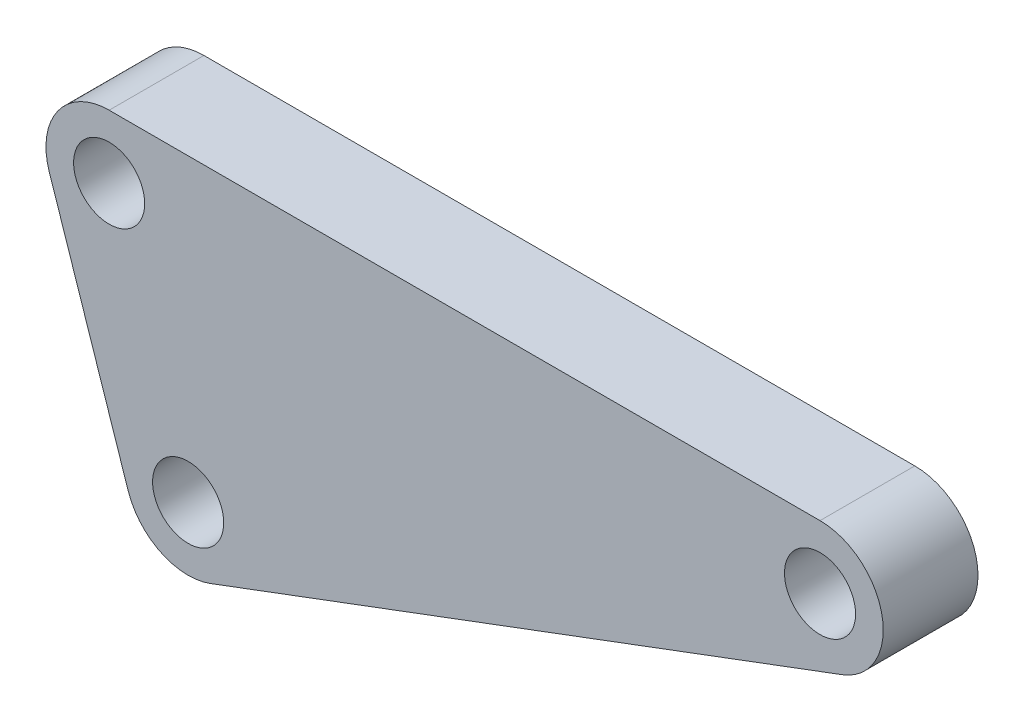
ISO-10303-21;
HEADER;
FILE_DESCRIPTION(('STEP AP214'),'2;1');
FILE_NAME('part.step','',(''),(''),'','','');
FILE_SCHEMA(('AUTOMOTIVE_DESIGN { 1 0 10303 214 1 1 1 1 }'));
ENDSEC;
DATA;
#1=APPLICATION_CONTEXT('core data for automotive mechanical design processes');
#2=APPLICATION_PROTOCOL_DEFINITION('international standard','automotive_design',2000,#1);
#3=PRODUCT_CONTEXT('',#1,'mechanical');
#4=PRODUCT('Part','Part','',(#3));
#5=PRODUCT_RELATED_PRODUCT_CATEGORY('part','',(#4));
#6=PRODUCT_DEFINITION_FORMATION('','',#4);
#7=PRODUCT_DEFINITION_CONTEXT('part definition',#1,'design');
#8=PRODUCT_DEFINITION('design','',#6,#7);
#9=PRODUCT_DEFINITION_SHAPE('','',#8);
#10=(LENGTH_UNIT() NAMED_UNIT(*) SI_UNIT(.MILLI.,.METRE.));
#11=(NAMED_UNIT(*) PLANE_ANGLE_UNIT() SI_UNIT($,.RADIAN.));
#12=(NAMED_UNIT(*) SI_UNIT($,.STERADIAN.) SOLID_ANGLE_UNIT());
#13=UNCERTAINTY_MEASURE_WITH_UNIT(LENGTH_MEASURE(1.E-05),#10,'distance_accuracy_value','');
#14=(GEOMETRIC_REPRESENTATION_CONTEXT(3) GLOBAL_UNCERTAINTY_ASSIGNED_CONTEXT((#13)) GLOBAL_UNIT_ASSIGNED_CONTEXT((#10,
#11,#12)) REPRESENTATION_CONTEXT('',''));
#15=CARTESIAN_POINT('',(0.,0.,0.));
#16=DIRECTION('',(0.,0.,1.));
#17=DIRECTION('',(1.,0.,0.));
#18=AXIS2_PLACEMENT_3D('',#15,#16,#17);
#19=CARTESIAN_POINT('',(-5.,15.,6.));
#20=DIRECTION('',(0.,0.,1.));
#21=DIRECTION('',(1.,0.,0.));
#22=AXIS2_PLACEMENT_3D('',#19,#20,#21);
#23=PLANE('',#22);
#24=CARTESIAN_POINT('',(-5.,15.,6.));
#25=DIRECTION('',(0.,0.,1.));
#26=DIRECTION('',(1.,0.,0.));
#27=AXIS2_PLACEMENT_3D('',#24,#25,#26);
#28=CIRCLE('',#27,2.25);
#29=CARTESIAN_POINT('',(-2.75,15.,6.));
#30=VERTEX_POINT('',#29);
#31=EDGE_CURVE('E184',#30,#30,#28,.T.);
#32=ORIENTED_EDGE('',*,*,#31,.F.);
#33=EDGE_LOOP('',(#32));
#34=FACE_BOUND('',#33,.T.);
#35=CARTESIAN_POINT('',(-5.,15.,6.));
#36=DIRECTION('',(0.,0.,1.));
#37=DIRECTION('',(1.,0.,0.));
#38=AXIS2_PLACEMENT_3D('',#35,#36,#37);
#39=CIRCLE('',#38,4.);
#40=CARTESIAN_POINT('',(-5.,19.,6.));
#41=VERTEX_POINT('',#40);
#42=CARTESIAN_POINT('',(-8.79473319220205,13.7350889359326,6.));
#43=VERTEX_POINT('',#42);
#44=EDGE_CURVE('E129',#41,#43,#39,.T.);
#45=ORIENTED_EDGE('',*,*,#44,.T.);
#46=DIRECTION('',(0.316227766016838,-0.948683298050514,0.));
#47=VECTOR('',#46,1.);
#48=CARTESIAN_POINT('',(-8.79473319220205,13.7350889359326,6.));
#49=LINE('',#48,#47);
#50=CARTESIAN_POINT('',(-3.79473319220206,-1.26491106406735,6.));
#51=VERTEX_POINT('',#50);
#52=EDGE_CURVE('E87',#43,#51,#49,.T.);
#53=ORIENTED_EDGE('',*,*,#52,.T.);
#54=CARTESIAN_POINT('',(0.,0.,6.));
#55=DIRECTION('',(0.,0.,1.));
#56=DIRECTION('',(1.,0.,0.));
#57=AXIS2_PLACEMENT_3D('',#54,#55,#56);
#58=CIRCLE('',#57,4.);
#59=CARTESIAN_POINT('',(1.40449376635357,-3.74531671027618,6.));
#60=VERTEX_POINT('',#59);
#61=EDGE_CURVE('E100',#51,#60,#58,.T.);
#62=ORIENTED_EDGE('',*,*,#61,.T.);
#63=DIRECTION('',(0.936329177569045,0.351123441588392,0.));
#64=VECTOR('',#63,1.);
#65=CARTESIAN_POINT('',(1.40449376635357,-3.74531671027618,6.));
#66=LINE('',#65,#64);
#67=CARTESIAN_POINT('',(41.4044937663536,11.2546832897238,6.));
#68=VERTEX_POINT('',#67);
#69=EDGE_CURVE('E94',#60,#68,#66,.T.);
#70=ORIENTED_EDGE('',*,*,#69,.T.);
#71=CARTESIAN_POINT('',(40.,15.,6.));
#72=DIRECTION('',(0.,0.,1.));
#73=DIRECTION('',(1.,0.,0.));
#74=AXIS2_PLACEMENT_3D('',#71,#72,#73);
#75=CIRCLE('',#74,4.);
#76=CARTESIAN_POINT('',(40.,19.,6.));
#77=VERTEX_POINT('',#76);
#78=EDGE_CURVE('E98',#68,#77,#75,.T.);
#79=ORIENTED_EDGE('',*,*,#78,.T.);
#80=DIRECTION('',(-1.,0.,0.));
#81=VECTOR('',#80,1.);
#82=CARTESIAN_POINT('',(-5.,19.,6.));
#83=LINE('',#82,#81);
#84=EDGE_CURVE('E50',#77,#41,#83,.T.);
#85=ORIENTED_EDGE('',*,*,#84,.T.);
#86=EDGE_LOOP('',(#45,#53,#62,#70,#79,#85));
#87=FACE_BOUND('',#86,.T.);
#88=CARTESIAN_POINT('',(0.,0.,6.));
#89=DIRECTION('',(0.,0.,1.));
#90=DIRECTION('',(1.,0.,0.));
#91=AXIS2_PLACEMENT_3D('',#88,#89,#90);
#92=CIRCLE('',#91,2.25);
#93=CARTESIAN_POINT('',(2.25,0.,6.));
#94=VERTEX_POINT('',#93);
#95=EDGE_CURVE('E122',#94,#94,#92,.T.);
#96=ORIENTED_EDGE('',*,*,#95,.F.);
#97=EDGE_LOOP('',(#96));
#98=FACE_BOUND('',#97,.T.);
#99=CARTESIAN_POINT('',(40.,15.,6.));
#100=DIRECTION('',(0.,0.,1.));
#101=DIRECTION('',(1.,0.,0.));
#102=AXIS2_PLACEMENT_3D('',#99,#100,#101);
#103=CIRCLE('',#102,2.25);
#104=CARTESIAN_POINT('',(42.25,15.,6.));
#105=VERTEX_POINT('',#104);
#106=EDGE_CURVE('E175',#105,#105,#103,.T.);
#107=ORIENTED_EDGE('',*,*,#106,.F.);
#108=EDGE_LOOP('',(#107));
#109=FACE_BOUND('',#108,.T.);
#110=ADVANCED_FACE('F33',(#34,#87,#98,#109),#23,.T.);
#111=CARTESIAN_POINT('',(-5.,15.,0.));
#112=DIRECTION('',(0.,0.,1.));
#113=DIRECTION('',(1.,0.,0.));
#114=AXIS2_PLACEMENT_3D('',#111,#112,#113);
#115=PLANE('',#114);
#116=CARTESIAN_POINT('',(-5.,15.,0.));
#117=DIRECTION('',(0.,0.,1.));
#118=DIRECTION('',(1.,0.,0.));
#119=AXIS2_PLACEMENT_3D('',#116,#117,#118);
#120=CIRCLE('',#119,4.);
#121=CARTESIAN_POINT('',(-5.,19.,0.));
#122=VERTEX_POINT('',#121);
#123=CARTESIAN_POINT('',(-8.79473319220205,13.7350889359326,0.));
#124=VERTEX_POINT('',#123);
#125=EDGE_CURVE('E118',#122,#124,#120,.T.);
#126=ORIENTED_EDGE('',*,*,#125,.F.);
#127=DIRECTION('',(-1.,0.,0.));
#128=VECTOR('',#127,1.);
#129=CARTESIAN_POINT('',(-5.,19.,0.));
#130=LINE('',#129,#128);
#131=CARTESIAN_POINT('',(40.,19.,0.));
#132=VERTEX_POINT('',#131);
#133=EDGE_CURVE('E79',#132,#122,#130,.T.);
#134=ORIENTED_EDGE('',*,*,#133,.F.);
#135=CARTESIAN_POINT('',(40.,15.,0.));
#136=DIRECTION('',(0.,0.,1.));
#137=DIRECTION('',(1.,0.,0.));
#138=AXIS2_PLACEMENT_3D('',#135,#136,#137);
#139=CIRCLE('',#138,4.);
#140=CARTESIAN_POINT('',(41.4044937663536,11.2546832897238,0.));
#141=VERTEX_POINT('',#140);
#142=EDGE_CURVE('E73',#141,#132,#139,.T.);
#143=ORIENTED_EDGE('',*,*,#142,.F.);
#144=DIRECTION('',(0.936329177569045,0.351123441588392,0.));
#145=VECTOR('',#144,1.);
#146=CARTESIAN_POINT('',(1.40449376635357,-3.74531671027618,0.));
#147=LINE('',#146,#145);
#148=CARTESIAN_POINT('',(1.40449376635357,-3.74531671027618,0.));
#149=VERTEX_POINT('',#148);
#150=EDGE_CURVE('E108',#149,#141,#147,.T.);
#151=ORIENTED_EDGE('',*,*,#150,.F.);
#152=CARTESIAN_POINT('',(0.,0.,0.));
#153=DIRECTION('',(0.,0.,1.));
#154=DIRECTION('',(1.,0.,0.));
#155=AXIS2_PLACEMENT_3D('',#152,#153,#154);
#156=CIRCLE('',#155,4.);
#157=CARTESIAN_POINT('',(-3.79473319220206,-1.26491106406735,0.));
#158=VERTEX_POINT('',#157);
#159=EDGE_CURVE('E124',#158,#149,#156,.T.);
#160=ORIENTED_EDGE('',*,*,#159,.F.);
#161=DIRECTION('',(0.316227766016838,-0.948683298050514,0.));
#162=VECTOR('',#161,1.);
#163=CARTESIAN_POINT('',(-8.79473319220205,13.7350889359326,0.));
#164=LINE('',#163,#162);
#165=EDGE_CURVE('E121',#124,#158,#164,.T.);
#166=ORIENTED_EDGE('',*,*,#165,.F.);
#167=EDGE_LOOP('',(#126,#134,#143,#151,#160,#166));
#168=FACE_BOUND('',#167,.T.);
#169=CARTESIAN_POINT('',(0.,0.,0.));
#170=DIRECTION('',(0.,0.,1.));
#171=DIRECTION('',(1.,0.,0.));
#172=AXIS2_PLACEMENT_3D('',#169,#170,#171);
#173=CIRCLE('',#172,2.25);
#174=CARTESIAN_POINT('',(2.25,0.,0.));
#175=VERTEX_POINT('',#174);
#176=EDGE_CURVE('E187',#175,#175,#173,.T.);
#177=ORIENTED_EDGE('',*,*,#176,.T.);
#178=EDGE_LOOP('',(#177));
#179=FACE_BOUND('',#178,.T.);
#180=CARTESIAN_POINT('',(-5.,15.,0.));
#181=DIRECTION('',(0.,0.,1.));
#182=DIRECTION('',(1.,0.,0.));
#183=AXIS2_PLACEMENT_3D('',#180,#181,#182);
#184=CIRCLE('',#183,2.25);
#185=CARTESIAN_POINT('',(-2.75,15.,0.));
#186=VERTEX_POINT('',#185);
#187=EDGE_CURVE('E181',#186,#186,#184,.T.);
#188=ORIENTED_EDGE('',*,*,#187,.T.);
#189=EDGE_LOOP('',(#188));
#190=FACE_BOUND('',#189,.T.);
#191=CARTESIAN_POINT('',(40.,15.,0.));
#192=DIRECTION('',(0.,0.,1.));
#193=DIRECTION('',(1.,0.,0.));
#194=AXIS2_PLACEMENT_3D('',#191,#192,#193);
#195=CIRCLE('',#194,2.25);
#196=CARTESIAN_POINT('',(42.25,15.,0.));
#197=VERTEX_POINT('',#196);
#198=EDGE_CURVE('E178',#197,#197,#195,.T.);
#199=ORIENTED_EDGE('',*,*,#198,.T.);
#200=EDGE_LOOP('',(#199));
#201=FACE_BOUND('',#200,.T.);
#202=ADVANCED_FACE('F138',(#168,#179,#190,#201),#115,.F.);
#203=CARTESIAN_POINT('',(-5.,15.,6.));
#204=DIRECTION('',(0.,0.,-1.));
#205=DIRECTION('',(-1.,0.,0.));
#206=AXIS2_PLACEMENT_3D('',#203,#204,#205);
#207=CYLINDRICAL_SURFACE('',#206,4.);
#208=ORIENTED_EDGE('',*,*,#125,.T.);
#209=DIRECTION('',(0.,0.,-1.));
#210=VECTOR('',#209,1.);
#211=CARTESIAN_POINT('',(-8.79473319220205,13.7350889359326,6.));
#212=LINE('',#211,#210);
#213=EDGE_CURVE('E11',#43,#124,#212,.T.);
#214=ORIENTED_EDGE('',*,*,#213,.F.);
#215=ORIENTED_EDGE('',*,*,#44,.F.);
#216=DIRECTION('',(0.,0.,-1.));
#217=VECTOR('',#216,1.);
#218=CARTESIAN_POINT('',(-5.,19.,6.));
#219=LINE('',#218,#217);
#220=EDGE_CURVE('E114',#41,#122,#219,.T.);
#221=ORIENTED_EDGE('',*,*,#220,.T.);
#222=EDGE_LOOP('',(#208,#214,#215,#221));
#223=FACE_BOUND('',#222,.T.);
#224=ADVANCED_FACE('F35',(#223),#207,.T.);
#225=CARTESIAN_POINT('',(-8.79473319220205,13.7350889359326,6.));
#226=DIRECTION('',(0.948683298050514,0.316227766016838,0.));
#227=DIRECTION('',(-0.316227766016838,0.948683298050514,0.));
#228=AXIS2_PLACEMENT_3D('',#225,#226,#227);
#229=PLANE('',#228);
#230=ORIENTED_EDGE('',*,*,#165,.T.);
#231=DIRECTION('',(0.,0.,-1.));
#232=VECTOR('',#231,1.);
#233=CARTESIAN_POINT('',(-3.79473319220206,-1.26491106406735,6.));
#234=LINE('',#233,#232);
#235=EDGE_CURVE('E42',#51,#158,#234,.T.);
#236=ORIENTED_EDGE('',*,*,#235,.F.);
#237=ORIENTED_EDGE('',*,*,#52,.F.);
#238=ORIENTED_EDGE('',*,*,#213,.T.);
#239=EDGE_LOOP('',(#230,#236,#237,#238));
#240=FACE_BOUND('',#239,.T.);
#241=ADVANCED_FACE('F237',(#240),#229,.F.);
#242=CARTESIAN_POINT('',(0.,0.,6.));
#243=DIRECTION('',(0.,0.,-1.));
#244=DIRECTION('',(-1.,0.,0.));
#245=AXIS2_PLACEMENT_3D('',#242,#243,#244);
#246=CYLINDRICAL_SURFACE('',#245,4.);
#247=ORIENTED_EDGE('',*,*,#159,.T.);
#248=DIRECTION('',(0.,0.,-1.));
#249=VECTOR('',#248,1.);
#250=CARTESIAN_POINT('',(1.40449376635357,-3.74531671027618,6.));
#251=LINE('',#250,#249);
#252=EDGE_CURVE('E109',#60,#149,#251,.T.);
#253=ORIENTED_EDGE('',*,*,#252,.F.);
#254=ORIENTED_EDGE('',*,*,#61,.F.);
#255=ORIENTED_EDGE('',*,*,#235,.T.);
#256=EDGE_LOOP('',(#247,#253,#254,#255));
#257=FACE_BOUND('',#256,.T.);
#258=ADVANCED_FACE('F135',(#257),#246,.T.);
#259=CARTESIAN_POINT('',(1.40449376635357,-3.74531671027618,6.));
#260=DIRECTION('',(-0.351123441588392,0.936329177569044,0.));
#261=DIRECTION('',(-0.936329177569045,-0.351123441588392,0.));
#262=AXIS2_PLACEMENT_3D('',#259,#260,#261);
#263=PLANE('',#262);
#264=ORIENTED_EDGE('',*,*,#150,.T.);
#265=DIRECTION('',(0.,0.,-1.));
#266=VECTOR('',#265,1.);
#267=CARTESIAN_POINT('',(41.4044937663536,11.2546832897238,6.));
#268=LINE('',#267,#266);
#269=EDGE_CURVE('E105',#68,#141,#268,.T.);
#270=ORIENTED_EDGE('',*,*,#269,.F.);
#271=ORIENTED_EDGE('',*,*,#69,.F.);
#272=ORIENTED_EDGE('',*,*,#252,.T.);
#273=EDGE_LOOP('',(#264,#270,#271,#272));
#274=FACE_BOUND('',#273,.T.);
#275=ADVANCED_FACE('F106',(#274),#263,.F.);
#276=CARTESIAN_POINT('',(40.,15.,6.));
#277=DIRECTION('',(0.,0.,-1.));
#278=DIRECTION('',(-1.,0.,0.));
#279=AXIS2_PLACEMENT_3D('',#276,#277,#278);
#280=CYLINDRICAL_SURFACE('',#279,4.);
#281=ORIENTED_EDGE('',*,*,#142,.T.);
#282=DIRECTION('',(0.,0.,-1.));
#283=VECTOR('',#282,1.);
#284=CARTESIAN_POINT('',(40.,19.,6.));
#285=LINE('',#284,#283);
#286=EDGE_CURVE('E110',#77,#132,#285,.T.);
#287=ORIENTED_EDGE('',*,*,#286,.F.);
#288=ORIENTED_EDGE('',*,*,#78,.F.);
#289=ORIENTED_EDGE('',*,*,#269,.T.);
#290=EDGE_LOOP('',(#281,#287,#288,#289));
#291=FACE_BOUND('',#290,.T.);
#292=ADVANCED_FACE('F112',(#291),#280,.T.);
#293=CARTESIAN_POINT('',(-5.,19.,6.));
#294=DIRECTION('',(0.,-1.,0.));
#295=DIRECTION('',(0.,0.,-1.));
#296=AXIS2_PLACEMENT_3D('',#293,#294,#295);
#297=PLANE('',#296);
#298=ORIENTED_EDGE('',*,*,#133,.T.);
#299=ORIENTED_EDGE('',*,*,#220,.F.);
#300=ORIENTED_EDGE('',*,*,#84,.F.);
#301=ORIENTED_EDGE('',*,*,#286,.T.);
#302=EDGE_LOOP('',(#298,#299,#300,#301));
#303=FACE_BOUND('',#302,.T.);
#304=ADVANCED_FACE('F143',(#303),#297,.F.);
#305=CARTESIAN_POINT('',(0.,0.,6.));
#306=DIRECTION('',(0.,0.,-1.));
#307=DIRECTION('',(-1.,0.,0.));
#308=AXIS2_PLACEMENT_3D('',#305,#306,#307);
#309=CYLINDRICAL_SURFACE('',#308,2.25);
#310=ORIENTED_EDGE('',*,*,#95,.T.);
#311=EDGE_LOOP('',(#310));
#312=FACE_BOUND('',#311,.T.);
#313=ORIENTED_EDGE('',*,*,#176,.F.);
#314=EDGE_LOOP('',(#313));
#315=FACE_BOUND('',#314,.T.);
#316=ADVANCED_FACE('F145',(#312,#315),#309,.F.);
#317=CARTESIAN_POINT('',(-5.,15.,6.));
#318=DIRECTION('',(0.,0.,-1.));
#319=DIRECTION('',(-1.,0.,0.));
#320=AXIS2_PLACEMENT_3D('',#317,#318,#319);
#321=CYLINDRICAL_SURFACE('',#320,2.25);
#322=ORIENTED_EDGE('',*,*,#31,.T.);
#323=EDGE_LOOP('',(#322));
#324=FACE_BOUND('',#323,.T.);
#325=ORIENTED_EDGE('',*,*,#187,.F.);
#326=EDGE_LOOP('',(#325));
#327=FACE_BOUND('',#326,.T.);
#328=ADVANCED_FACE('F151',(#324,#327),#321,.F.);
#329=CARTESIAN_POINT('',(40.,15.,6.));
#330=DIRECTION('',(0.,0.,-1.));
#331=DIRECTION('',(-1.,0.,0.));
#332=AXIS2_PLACEMENT_3D('',#329,#330,#331);
#333=CYLINDRICAL_SURFACE('',#332,2.25);
#334=ORIENTED_EDGE('',*,*,#106,.T.);
#335=EDGE_LOOP('',(#334));
#336=FACE_BOUND('',#335,.T.);
#337=ORIENTED_EDGE('',*,*,#198,.F.);
#338=EDGE_LOOP('',(#337));
#339=FACE_BOUND('',#338,.T.);
#340=ADVANCED_FACE('F166',(#336,#339),#333,.F.);
#341=CLOSED_SHELL('',(#110,#202,#224,#241,#258,#275,#292,#304,#316,#328,#340));
#342=MANIFOLD_SOLID_BREP('B2',#341);
#343=ADVANCED_BREP_SHAPE_REPRESENTATION('',(#18,#342),#14);
#344=SHAPE_DEFINITION_REPRESENTATION(#9,#343);
ENDSEC;
END-ISO-10303-21;
